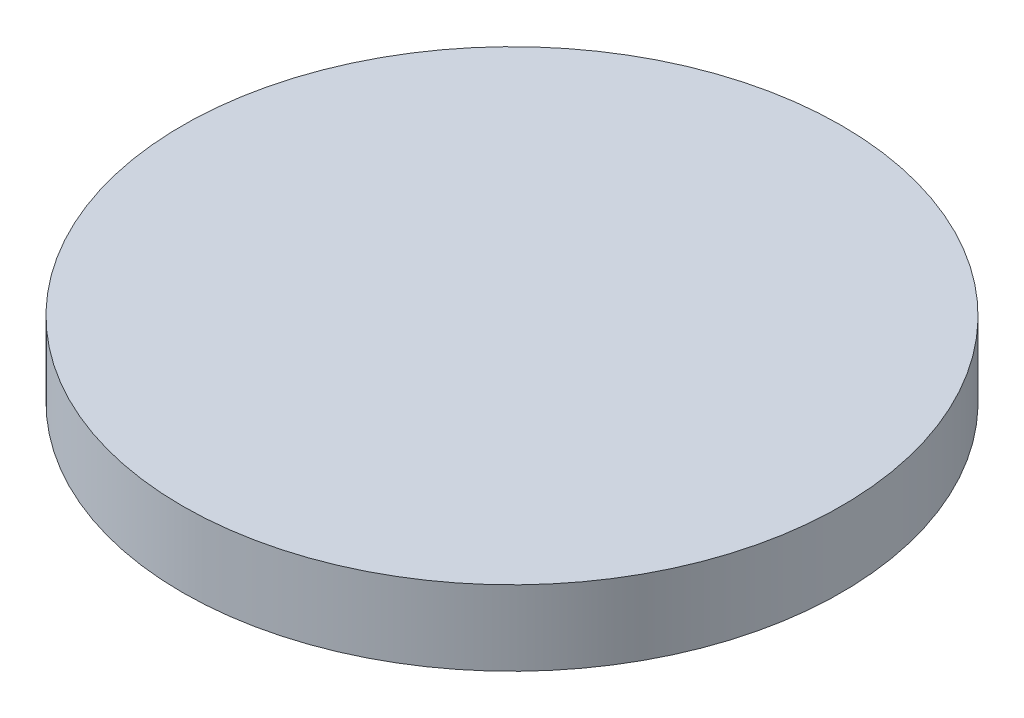
ISO-10303-21;
HEADER;
FILE_DESCRIPTION(('STEP AP214'),'2;1');
FILE_NAME('part.step','',(''),(''),'','','');
FILE_SCHEMA(('AUTOMOTIVE_DESIGN { 1 0 10303 214 1 1 1 1 }'));
ENDSEC;
DATA;
#1=APPLICATION_CONTEXT('core data for automotive mechanical design processes');
#2=APPLICATION_PROTOCOL_DEFINITION('international standard','automotive_design',2000,#1);
#3=PRODUCT_CONTEXT('',#1,'mechanical');
#4=PRODUCT('Part','Part','',(#3));
#5=PRODUCT_RELATED_PRODUCT_CATEGORY('part','',(#4));
#6=PRODUCT_DEFINITION_FORMATION('','',#4);
#7=PRODUCT_DEFINITION_CONTEXT('part definition',#1,'design');
#8=PRODUCT_DEFINITION('design','',#6,#7);
#9=PRODUCT_DEFINITION_SHAPE('','',#8);
#10=(LENGTH_UNIT() NAMED_UNIT(*) SI_UNIT(.MILLI.,.METRE.));
#11=(NAMED_UNIT(*) PLANE_ANGLE_UNIT() SI_UNIT($,.RADIAN.));
#12=(NAMED_UNIT(*) SI_UNIT($,.STERADIAN.) SOLID_ANGLE_UNIT());
#13=UNCERTAINTY_MEASURE_WITH_UNIT(LENGTH_MEASURE(1.E-05),#10,'distance_accuracy_value','');
#14=(GEOMETRIC_REPRESENTATION_CONTEXT(3) GLOBAL_UNCERTAINTY_ASSIGNED_CONTEXT((#13)) GLOBAL_UNIT_ASSIGNED_CONTEXT((#10,
#11,#12)) REPRESENTATION_CONTEXT('',''));
#15=CARTESIAN_POINT('',(0.,0.,0.));
#16=DIRECTION('',(0.,0.,1.));
#17=DIRECTION('',(1.,0.,0.));
#18=AXIS2_PLACEMENT_3D('',#15,#16,#17);
#19=CARTESIAN_POINT('',(0.,3.175,0.));
#20=DIRECTION('',(0.,-1.,0.));
#21=DIRECTION('',(0.,0.,-1.));
#22=AXIS2_PLACEMENT_3D('',#19,#20,#21);
#23=CYLINDRICAL_SURFACE('',#22,13.97);
#24=CARTESIAN_POINT('',(0.,3.175,0.));
#25=DIRECTION('',(0.,1.,0.));
#26=DIRECTION('',(0.,0.,1.));
#27=AXIS2_PLACEMENT_3D('',#24,#25,#26);
#28=CIRCLE('',#27,13.97);
#29=CARTESIAN_POINT('',(0.,3.175,13.97));
#30=VERTEX_POINT('',#29);
#31=EDGE_CURVE('E10',#30,#30,#28,.T.);
#32=ORIENTED_EDGE('',*,*,#31,.F.);
#33=EDGE_LOOP('',(#32));
#34=FACE_BOUND('',#33,.T.);
#35=CARTESIAN_POINT('',(0.,0.,0.));
#36=DIRECTION('',(0.,1.,0.));
#37=DIRECTION('',(0.,0.,1.));
#38=AXIS2_PLACEMENT_3D('',#35,#36,#37);
#39=CIRCLE('',#38,13.97);
#40=CARTESIAN_POINT('',(0.,0.,13.97));
#41=VERTEX_POINT('',#40);
#42=EDGE_CURVE('E34',#41,#41,#39,.T.);
#43=ORIENTED_EDGE('',*,*,#42,.T.);
#44=EDGE_LOOP('',(#43));
#45=FACE_BOUND('',#44,.T.);
#46=ADVANCED_FACE('F31',(#34,#45),#23,.T.);
#47=CARTESIAN_POINT('',(0.,3.175,0.));
#48=DIRECTION('',(0.,1.,0.));
#49=DIRECTION('',(0.,0.,1.));
#50=AXIS2_PLACEMENT_3D('',#47,#48,#49);
#51=PLANE('',#50);
#52=ORIENTED_EDGE('',*,*,#31,.T.);
#53=EDGE_LOOP('',(#52));
#54=FACE_BOUND('',#53,.T.);
#55=ADVANCED_FACE('F46',(#54),#51,.T.);
#56=CARTESIAN_POINT('',(0.,0.,0.));
#57=DIRECTION('',(0.,1.,0.));
#58=DIRECTION('',(0.,0.,1.));
#59=AXIS2_PLACEMENT_3D('',#56,#57,#58);
#60=PLANE('',#59);
#61=ORIENTED_EDGE('',*,*,#42,.F.);
#62=EDGE_LOOP('',(#61));
#63=FACE_BOUND('',#62,.T.);
#64=ADVANCED_FACE('F44',(#63),#60,.F.);
#65=CLOSED_SHELL('',(#46,#55,#64));
#66=MANIFOLD_SOLID_BREP('B2',#65);
#67=ADVANCED_BREP_SHAPE_REPRESENTATION('',(#18,#66),#14);
#68=SHAPE_DEFINITION_REPRESENTATION(#9,#67);
ENDSEC;
END-ISO-10303-21;
